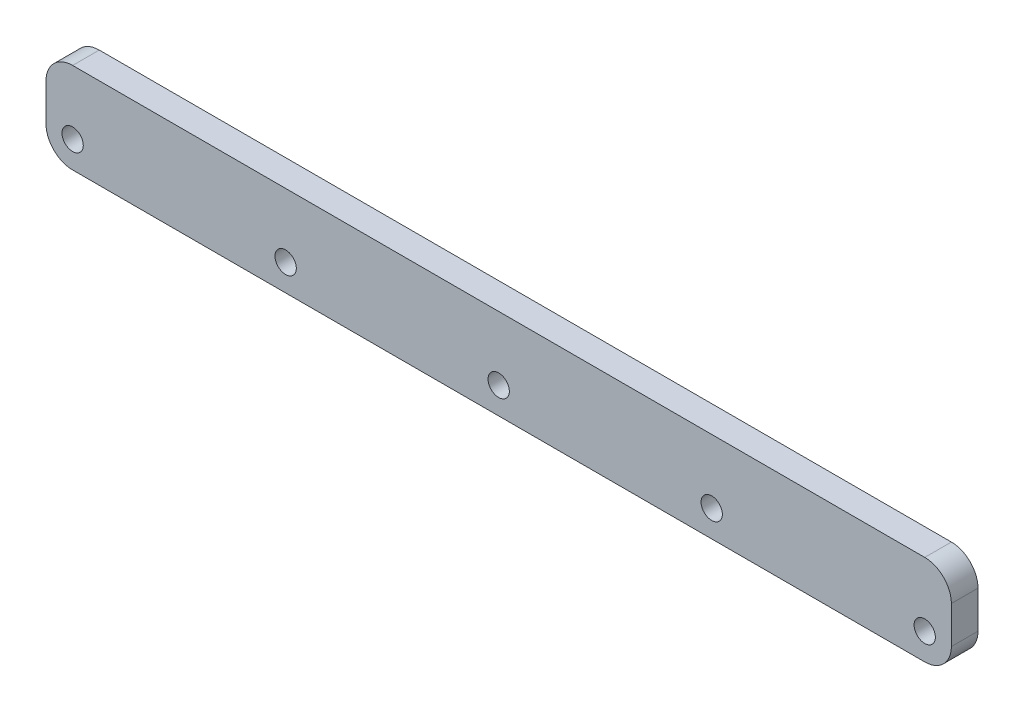
ISO-10303-21;
HEADER;
FILE_DESCRIPTION(('STEP AP214'),'2;1');
FILE_NAME('part.step','',(''),(''),'','','');
FILE_SCHEMA(('AUTOMOTIVE_DESIGN { 1 0 10303 214 1 1 1 1 }'));
ENDSEC;
DATA;
#1=APPLICATION_CONTEXT('core data for automotive mechanical design processes');
#2=APPLICATION_PROTOCOL_DEFINITION('international standard','automotive_design',2000,#1);
#3=PRODUCT_CONTEXT('',#1,'mechanical');
#4=PRODUCT('Part','Part','',(#3));
#5=PRODUCT_RELATED_PRODUCT_CATEGORY('part','',(#4));
#6=PRODUCT_DEFINITION_FORMATION('','',#4);
#7=PRODUCT_DEFINITION_CONTEXT('part definition',#1,'design');
#8=PRODUCT_DEFINITION('design','',#6,#7);
#9=PRODUCT_DEFINITION_SHAPE('','',#8);
#10=(LENGTH_UNIT() NAMED_UNIT(*) SI_UNIT(.MILLI.,.METRE.));
#11=(NAMED_UNIT(*) PLANE_ANGLE_UNIT() SI_UNIT($,.RADIAN.));
#12=(NAMED_UNIT(*) SI_UNIT($,.STERADIAN.) SOLID_ANGLE_UNIT());
#13=UNCERTAINTY_MEASURE_WITH_UNIT(LENGTH_MEASURE(1.E-05),#10,'distance_accuracy_value','');
#14=(GEOMETRIC_REPRESENTATION_CONTEXT(3) GLOBAL_UNCERTAINTY_ASSIGNED_CONTEXT((#13)) GLOBAL_UNIT_ASSIGNED_CONTEXT((#10,
#11,#12)) REPRESENTATION_CONTEXT('',''));
#15=CARTESIAN_POINT('',(0.,0.,0.));
#16=DIRECTION('',(0.,0.,1.));
#17=DIRECTION('',(1.,0.,0.));
#18=AXIS2_PLACEMENT_3D('',#15,#16,#17);
#19=CARTESIAN_POINT('',(0.,0.,5.));
#20=DIRECTION('',(0.,0.,-1.));
#21=DIRECTION('',(-1.,0.,0.));
#22=AXIS2_PLACEMENT_3D('',#19,#20,#21);
#23=PLANE('',#22);
#24=DIRECTION('',(1.,0.,0.));
#25=VECTOR('',#24,1.);
#26=CARTESIAN_POINT('',(0.,0.,5.));
#27=LINE('',#26,#25);
#28=CARTESIAN_POINT('',(5.,0.,5.));
#29=VERTEX_POINT('',#28);
#30=CARTESIAN_POINT('',(165.,0.,5.));
#31=VERTEX_POINT('',#30);
#32=EDGE_CURVE('E171',#29,#31,#27,.T.);
#33=ORIENTED_EDGE('',*,*,#32,.T.);
#34=CARTESIAN_POINT('',(165.,5.,5.));
#35=DIRECTION('',(0.,0.,-1.));
#36=DIRECTION('',(-1.,0.,0.));
#37=AXIS2_PLACEMENT_3D('',#34,#35,#36);
#38=CIRCLE('',#37,5.);
#39=CARTESIAN_POINT('',(170.,5.,5.));
#40=VERTEX_POINT('',#39);
#41=EDGE_CURVE('E148',#31,#40,#38,.F.);
#42=ORIENTED_EDGE('',*,*,#41,.T.);
#43=DIRECTION('',(0.,1.,0.));
#44=VECTOR('',#43,1.);
#45=CARTESIAN_POINT('',(170.,0.,5.));
#46=LINE('',#45,#44);
#47=CARTESIAN_POINT('',(170.,12.,5.));
#48=VERTEX_POINT('',#47);
#49=EDGE_CURVE('E118',#40,#48,#46,.T.);
#50=ORIENTED_EDGE('',*,*,#49,.T.);
#51=CARTESIAN_POINT('',(165.,12.,5.));
#52=DIRECTION('',(0.,0.,-1.));
#53=DIRECTION('',(-1.,0.,0.));
#54=AXIS2_PLACEMENT_3D('',#51,#52,#53);
#55=CIRCLE('',#54,5.);
#56=CARTESIAN_POINT('',(165.,17.,5.));
#57=VERTEX_POINT('',#56);
#58=EDGE_CURVE('E55',#48,#57,#55,.F.);
#59=ORIENTED_EDGE('',*,*,#58,.T.);
#60=DIRECTION('',(-1.,0.,0.));
#61=VECTOR('',#60,1.);
#62=CARTESIAN_POINT('',(0.,17.,5.));
#63=LINE('',#62,#61);
#64=CARTESIAN_POINT('',(5.,17.,5.));
#65=VERTEX_POINT('',#64);
#66=EDGE_CURVE('E134',#57,#65,#63,.T.);
#67=ORIENTED_EDGE('',*,*,#66,.T.);
#68=CARTESIAN_POINT('',(5.,12.,5.));
#69=DIRECTION('',(0.,0.,-1.));
#70=DIRECTION('',(-1.,0.,0.));
#71=AXIS2_PLACEMENT_3D('',#68,#69,#70);
#72=CIRCLE('',#71,5.);
#73=CARTESIAN_POINT('',(0.,12.,5.));
#74=VERTEX_POINT('',#73);
#75=EDGE_CURVE('E143',#65,#74,#72,.F.);
#76=ORIENTED_EDGE('',*,*,#75,.T.);
#77=DIRECTION('',(0.,-1.,0.));
#78=VECTOR('',#77,1.);
#79=CARTESIAN_POINT('',(0.,0.,5.));
#80=LINE('',#79,#78);
#81=CARTESIAN_POINT('',(0.,5.,5.));
#82=VERTEX_POINT('',#81);
#83=EDGE_CURVE('E128',#74,#82,#80,.T.);
#84=ORIENTED_EDGE('',*,*,#83,.T.);
#85=CARTESIAN_POINT('',(5.,5.,5.));
#86=DIRECTION('',(0.,0.,-1.));
#87=DIRECTION('',(-1.,0.,0.));
#88=AXIS2_PLACEMENT_3D('',#85,#86,#87);
#89=CIRCLE('',#88,5.);
#90=EDGE_CURVE('E145',#82,#29,#89,.F.);
#91=ORIENTED_EDGE('',*,*,#90,.T.);
#92=EDGE_LOOP('',(#33,#42,#50,#59,#67,#76,#84,#91));
#93=FACE_BOUND('',#92,.T.);
#94=CARTESIAN_POINT('',(5.,5.,5.));
#95=DIRECTION('',(0.,0.,1.));
#96=DIRECTION('',(1.,0.,0.));
#97=AXIS2_PLACEMENT_3D('',#94,#95,#96);
#98=CIRCLE('',#97,2.);
#99=CARTESIAN_POINT('',(7.,5.,5.));
#100=VERTEX_POINT('',#99);
#101=EDGE_CURVE('E164',#100,#100,#98,.T.);
#102=ORIENTED_EDGE('',*,*,#101,.F.);
#103=EDGE_LOOP('',(#102));
#104=FACE_BOUND('',#103,.T.);
#105=CARTESIAN_POINT('',(45.,5.,5.));
#106=DIRECTION('',(0.,0.,1.));
#107=DIRECTION('',(1.,0.,0.));
#108=AXIS2_PLACEMENT_3D('',#105,#106,#107);
#109=CIRCLE('',#108,2.);
#110=CARTESIAN_POINT('',(47.,5.,5.));
#111=VERTEX_POINT('',#110);
#112=EDGE_CURVE('E176',#111,#111,#109,.T.);
#113=ORIENTED_EDGE('',*,*,#112,.F.);
#114=EDGE_LOOP('',(#113));
#115=FACE_BOUND('',#114,.T.);
#116=CARTESIAN_POINT('',(85.,5.,5.));
#117=DIRECTION('',(0.,0.,1.));
#118=DIRECTION('',(1.,0.,0.));
#119=AXIS2_PLACEMENT_3D('',#116,#117,#118);
#120=CIRCLE('',#119,2.);
#121=CARTESIAN_POINT('',(87.,5.,5.));
#122=VERTEX_POINT('',#121);
#123=EDGE_CURVE('E181',#122,#122,#120,.T.);
#124=ORIENTED_EDGE('',*,*,#123,.F.);
#125=EDGE_LOOP('',(#124));
#126=FACE_BOUND('',#125,.T.);
#127=CARTESIAN_POINT('',(125.,5.,5.));
#128=DIRECTION('',(0.,0.,1.));
#129=DIRECTION('',(1.,0.,0.));
#130=AXIS2_PLACEMENT_3D('',#127,#128,#129);
#131=CIRCLE('',#130,2.);
#132=CARTESIAN_POINT('',(127.,5.,5.));
#133=VERTEX_POINT('',#132);
#134=EDGE_CURVE('E187',#133,#133,#131,.T.);
#135=ORIENTED_EDGE('',*,*,#134,.F.);
#136=EDGE_LOOP('',(#135));
#137=FACE_BOUND('',#136,.T.);
#138=CARTESIAN_POINT('',(165.,5.,5.));
#139=DIRECTION('',(0.,0.,1.));
#140=DIRECTION('',(1.,0.,0.));
#141=AXIS2_PLACEMENT_3D('',#138,#139,#140);
#142=CIRCLE('',#141,2.);
#143=CARTESIAN_POINT('',(167.,5.,5.));
#144=VERTEX_POINT('',#143);
#145=EDGE_CURVE('E193',#144,#144,#142,.T.);
#146=ORIENTED_EDGE('',*,*,#145,.F.);
#147=EDGE_LOOP('',(#146));
#148=FACE_BOUND('',#147,.T.);
#149=ADVANCED_FACE('F33',(#93,#104,#115,#126,#137,#148),#23,.F.);
#150=CARTESIAN_POINT('',(0.,0.,0.));
#151=DIRECTION('',(0.,0.,-1.));
#152=DIRECTION('',(-1.,0.,0.));
#153=AXIS2_PLACEMENT_3D('',#150,#151,#152);
#154=PLANE('',#153);
#155=CARTESIAN_POINT('',(125.,5.,0.));
#156=DIRECTION('',(0.,0.,1.));
#157=DIRECTION('',(1.,0.,0.));
#158=AXIS2_PLACEMENT_3D('',#155,#156,#157);
#159=CIRCLE('',#158,2.);
#160=CARTESIAN_POINT('',(127.,5.,0.));
#161=VERTEX_POINT('',#160);
#162=EDGE_CURVE('E190',#161,#161,#159,.T.);
#163=ORIENTED_EDGE('',*,*,#162,.T.);
#164=EDGE_LOOP('',(#163));
#165=FACE_BOUND('',#164,.T.);
#166=CARTESIAN_POINT('',(45.,5.,0.));
#167=DIRECTION('',(0.,0.,1.));
#168=DIRECTION('',(1.,0.,0.));
#169=AXIS2_PLACEMENT_3D('',#166,#167,#168);
#170=CIRCLE('',#169,2.);
#171=CARTESIAN_POINT('',(47.,5.,0.));
#172=VERTEX_POINT('',#171);
#173=EDGE_CURVE('E178',#172,#172,#170,.T.);
#174=ORIENTED_EDGE('',*,*,#173,.T.);
#175=EDGE_LOOP('',(#174));
#176=FACE_BOUND('',#175,.T.);
#177=DIRECTION('',(0.,1.,0.));
#178=VECTOR('',#177,1.);
#179=CARTESIAN_POINT('',(170.,0.,0.));
#180=LINE('',#179,#178);
#181=CARTESIAN_POINT('',(170.,5.,0.));
#182=VERTEX_POINT('',#181);
#183=CARTESIAN_POINT('',(170.,12.,0.));
#184=VERTEX_POINT('',#183);
#185=EDGE_CURVE('E116',#182,#184,#180,.T.);
#186=ORIENTED_EDGE('',*,*,#185,.F.);
#187=CARTESIAN_POINT('',(165.,5.,0.));
#188=DIRECTION('',(0.,0.,-1.));
#189=DIRECTION('',(-1.,0.,0.));
#190=AXIS2_PLACEMENT_3D('',#187,#188,#189);
#191=CIRCLE('',#190,5.);
#192=CARTESIAN_POINT('',(165.,0.,0.));
#193=VERTEX_POINT('',#192);
#194=EDGE_CURVE('E99',#182,#193,#191,.T.);
#195=ORIENTED_EDGE('',*,*,#194,.T.);
#196=DIRECTION('',(1.,0.,0.));
#197=VECTOR('',#196,1.);
#198=CARTESIAN_POINT('',(0.,0.,0.));
#199=LINE('',#198,#197);
#200=CARTESIAN_POINT('',(5.,0.,0.));
#201=VERTEX_POINT('',#200);
#202=EDGE_CURVE('E126',#201,#193,#199,.T.);
#203=ORIENTED_EDGE('',*,*,#202,.F.);
#204=CARTESIAN_POINT('',(5.,5.,0.));
#205=DIRECTION('',(0.,0.,-1.));
#206=DIRECTION('',(-1.,0.,0.));
#207=AXIS2_PLACEMENT_3D('',#204,#205,#206);
#208=CIRCLE('',#207,5.);
#209=CARTESIAN_POINT('',(0.,5.,0.));
#210=VERTEX_POINT('',#209);
#211=EDGE_CURVE('E137',#201,#210,#208,.T.);
#212=ORIENTED_EDGE('',*,*,#211,.T.);
#213=DIRECTION('',(0.,-1.,0.));
#214=VECTOR('',#213,1.);
#215=CARTESIAN_POINT('',(0.,0.,0.));
#216=LINE('',#215,#214);
#217=CARTESIAN_POINT('',(0.,12.,0.));
#218=VERTEX_POINT('',#217);
#219=EDGE_CURVE('E130',#218,#210,#216,.T.);
#220=ORIENTED_EDGE('',*,*,#219,.F.);
#221=CARTESIAN_POINT('',(5.,12.,0.));
#222=DIRECTION('',(0.,0.,-1.));
#223=DIRECTION('',(-1.,0.,0.));
#224=AXIS2_PLACEMENT_3D('',#221,#222,#223);
#225=CIRCLE('',#224,5.);
#226=CARTESIAN_POINT('',(5.,17.,0.));
#227=VERTEX_POINT('',#226);
#228=EDGE_CURVE('E119',#218,#227,#225,.T.);
#229=ORIENTED_EDGE('',*,*,#228,.T.);
#230=DIRECTION('',(-1.,0.,0.));
#231=VECTOR('',#230,1.);
#232=CARTESIAN_POINT('',(0.,17.,0.));
#233=LINE('',#232,#231);
#234=CARTESIAN_POINT('',(165.,17.,0.));
#235=VERTEX_POINT('',#234);
#236=EDGE_CURVE('E125',#235,#227,#233,.T.);
#237=ORIENTED_EDGE('',*,*,#236,.F.);
#238=CARTESIAN_POINT('',(165.,12.,0.));
#239=DIRECTION('',(0.,0.,-1.));
#240=DIRECTION('',(-1.,0.,0.));
#241=AXIS2_PLACEMENT_3D('',#238,#239,#240);
#242=CIRCLE('',#241,5.);
#243=EDGE_CURVE('E110',#235,#184,#242,.T.);
#244=ORIENTED_EDGE('',*,*,#243,.T.);
#245=EDGE_LOOP('',(#186,#195,#203,#212,#220,#229,#237,#244));
#246=FACE_BOUND('',#245,.T.);
#247=CARTESIAN_POINT('',(5.,5.,0.));
#248=DIRECTION('',(0.,0.,1.));
#249=DIRECTION('',(1.,0.,0.));
#250=AXIS2_PLACEMENT_3D('',#247,#248,#249);
#251=CIRCLE('',#250,2.);
#252=CARTESIAN_POINT('',(7.,5.,0.));
#253=VERTEX_POINT('',#252);
#254=EDGE_CURVE('E166',#253,#253,#251,.T.);
#255=ORIENTED_EDGE('',*,*,#254,.T.);
#256=EDGE_LOOP('',(#255));
#257=FACE_BOUND('',#256,.T.);
#258=CARTESIAN_POINT('',(85.,5.,0.));
#259=DIRECTION('',(0.,0.,1.));
#260=DIRECTION('',(1.,0.,0.));
#261=AXIS2_PLACEMENT_3D('',#258,#259,#260);
#262=CIRCLE('',#261,2.);
#263=CARTESIAN_POINT('',(87.,5.,0.));
#264=VERTEX_POINT('',#263);
#265=EDGE_CURVE('E184',#264,#264,#262,.T.);
#266=ORIENTED_EDGE('',*,*,#265,.T.);
#267=EDGE_LOOP('',(#266));
#268=FACE_BOUND('',#267,.T.);
#269=CARTESIAN_POINT('',(165.,5.,0.));
#270=DIRECTION('',(0.,0.,1.));
#271=DIRECTION('',(1.,0.,0.));
#272=AXIS2_PLACEMENT_3D('',#269,#270,#271);
#273=CIRCLE('',#272,2.);
#274=CARTESIAN_POINT('',(167.,5.,0.));
#275=VERTEX_POINT('',#274);
#276=EDGE_CURVE('E196',#275,#275,#273,.T.);
#277=ORIENTED_EDGE('',*,*,#276,.T.);
#278=EDGE_LOOP('',(#277));
#279=FACE_BOUND('',#278,.T.);
#280=ADVANCED_FACE('F122',(#165,#176,#246,#257,#268,#279),#154,.T.);
#281=CARTESIAN_POINT('',(0.,0.,5.));
#282=DIRECTION('',(1.,0.,0.));
#283=DIRECTION('',(0.,0.,-1.));
#284=AXIS2_PLACEMENT_3D('',#281,#282,#283);
#285=PLANE('',#284);
#286=ORIENTED_EDGE('',*,*,#219,.T.);
#287=DIRECTION('',(0.,0.,-1.));
#288=VECTOR('',#287,1.);
#289=CARTESIAN_POINT('',(0.,5.,5.));
#290=LINE('',#289,#288);
#291=EDGE_CURVE('E11',#210,#82,#290,.F.);
#292=ORIENTED_EDGE('',*,*,#291,.T.);
#293=ORIENTED_EDGE('',*,*,#83,.F.);
#294=DIRECTION('',(0.,0.,-1.));
#295=VECTOR('',#294,1.);
#296=CARTESIAN_POINT('',(0.,12.,5.));
#297=LINE('',#296,#295);
#298=EDGE_CURVE('E41',#74,#218,#297,.T.);
#299=ORIENTED_EDGE('',*,*,#298,.T.);
#300=EDGE_LOOP('',(#286,#292,#293,#299));
#301=FACE_BOUND('',#300,.T.);
#302=ADVANCED_FACE('F159',(#301),#285,.F.);
#303=CARTESIAN_POINT('',(0.,0.,5.));
#304=DIRECTION('',(0.,1.,0.));
#305=DIRECTION('',(0.,0.,1.));
#306=AXIS2_PLACEMENT_3D('',#303,#304,#305);
#307=PLANE('',#306);
#308=ORIENTED_EDGE('',*,*,#202,.T.);
#309=DIRECTION('',(0.,0.,-1.));
#310=VECTOR('',#309,1.);
#311=CARTESIAN_POINT('',(165.,0.,5.));
#312=LINE('',#311,#310);
#313=EDGE_CURVE('E104',#193,#31,#312,.F.);
#314=ORIENTED_EDGE('',*,*,#313,.T.);
#315=ORIENTED_EDGE('',*,*,#32,.F.);
#316=DIRECTION('',(0.,0.,-1.));
#317=VECTOR('',#316,1.);
#318=CARTESIAN_POINT('',(5.,0.,5.));
#319=LINE('',#318,#317);
#320=EDGE_CURVE('E109',#29,#201,#319,.T.);
#321=ORIENTED_EDGE('',*,*,#320,.T.);
#322=EDGE_LOOP('',(#308,#314,#315,#321));
#323=FACE_BOUND('',#322,.T.);
#324=ADVANCED_FACE('F222',(#323),#307,.F.);
#325=CARTESIAN_POINT('',(170.,0.,5.));
#326=DIRECTION('',(-1.,0.,0.));
#327=DIRECTION('',(0.,0.,1.));
#328=AXIS2_PLACEMENT_3D('',#325,#326,#327);
#329=PLANE('',#328);
#330=ORIENTED_EDGE('',*,*,#49,.F.);
#331=DIRECTION('',(0.,0.,-1.));
#332=VECTOR('',#331,1.);
#333=CARTESIAN_POINT('',(170.,5.,5.));
#334=LINE('',#333,#332);
#335=EDGE_CURVE('E103',#40,#182,#334,.T.);
#336=ORIENTED_EDGE('',*,*,#335,.T.);
#337=ORIENTED_EDGE('',*,*,#185,.T.);
#338=DIRECTION('',(0.,0.,-1.));
#339=VECTOR('',#338,1.);
#340=CARTESIAN_POINT('',(170.,12.,5.));
#341=LINE('',#340,#339);
#342=EDGE_CURVE('E120',#184,#48,#341,.F.);
#343=ORIENTED_EDGE('',*,*,#342,.T.);
#344=EDGE_LOOP('',(#330,#336,#337,#343));
#345=FACE_BOUND('',#344,.T.);
#346=ADVANCED_FACE('F115',(#345),#329,.F.);
#347=CARTESIAN_POINT('',(0.,17.,5.));
#348=DIRECTION('',(0.,-1.,0.));
#349=DIRECTION('',(0.,0.,-1.));
#350=AXIS2_PLACEMENT_3D('',#347,#348,#349);
#351=PLANE('',#350);
#352=ORIENTED_EDGE('',*,*,#66,.F.);
#353=DIRECTION('',(0.,0.,-1.));
#354=VECTOR('',#353,1.);
#355=CARTESIAN_POINT('',(165.,17.,5.));
#356=LINE('',#355,#354);
#357=EDGE_CURVE('E151',#57,#235,#356,.T.);
#358=ORIENTED_EDGE('',*,*,#357,.T.);
#359=ORIENTED_EDGE('',*,*,#236,.T.);
#360=DIRECTION('',(0.,0.,-1.));
#361=VECTOR('',#360,1.);
#362=CARTESIAN_POINT('',(5.,17.,5.));
#363=LINE('',#362,#361);
#364=EDGE_CURVE('E48',#227,#65,#363,.F.);
#365=ORIENTED_EDGE('',*,*,#364,.T.);
#366=EDGE_LOOP('',(#352,#358,#359,#365));
#367=FACE_BOUND('',#366,.T.);
#368=ADVANCED_FACE('F217',(#367),#351,.F.);
#369=CARTESIAN_POINT('',(5.,5.,5.));
#370=DIRECTION('',(0.,0.,-1.));
#371=DIRECTION('',(-1.,0.,0.));
#372=AXIS2_PLACEMENT_3D('',#369,#370,#371);
#373=CYLINDRICAL_SURFACE('',#372,2.);
#374=ORIENTED_EDGE('',*,*,#101,.T.);
#375=EDGE_LOOP('',(#374));
#376=FACE_BOUND('',#375,.T.);
#377=ORIENTED_EDGE('',*,*,#254,.F.);
#378=EDGE_LOOP('',(#377));
#379=FACE_BOUND('',#378,.T.);
#380=ADVANCED_FACE('F214',(#376,#379),#373,.F.);
#381=CARTESIAN_POINT('',(45.,5.,5.));
#382=DIRECTION('',(0.,0.,-1.));
#383=DIRECTION('',(-1.,0.,0.));
#384=AXIS2_PLACEMENT_3D('',#381,#382,#383);
#385=CYLINDRICAL_SURFACE('',#384,2.);
#386=ORIENTED_EDGE('',*,*,#112,.T.);
#387=EDGE_LOOP('',(#386));
#388=FACE_BOUND('',#387,.T.);
#389=ORIENTED_EDGE('',*,*,#173,.F.);
#390=EDGE_LOOP('',(#389));
#391=FACE_BOUND('',#390,.T.);
#392=ADVANCED_FACE('F325',(#388,#391),#385,.F.);
#393=CARTESIAN_POINT('',(85.,5.,5.));
#394=DIRECTION('',(0.,0.,-1.));
#395=DIRECTION('',(-1.,0.,0.));
#396=AXIS2_PLACEMENT_3D('',#393,#394,#395);
#397=CYLINDRICAL_SURFACE('',#396,2.);
#398=ORIENTED_EDGE('',*,*,#123,.T.);
#399=EDGE_LOOP('',(#398));
#400=FACE_BOUND('',#399,.T.);
#401=ORIENTED_EDGE('',*,*,#265,.F.);
#402=EDGE_LOOP('',(#401));
#403=FACE_BOUND('',#402,.T.);
#404=ADVANCED_FACE('F315',(#400,#403),#397,.F.);
#405=CARTESIAN_POINT('',(125.,5.,5.));
#406=DIRECTION('',(0.,0.,-1.));
#407=DIRECTION('',(-1.,0.,0.));
#408=AXIS2_PLACEMENT_3D('',#405,#406,#407);
#409=CYLINDRICAL_SURFACE('',#408,2.);
#410=ORIENTED_EDGE('',*,*,#134,.T.);
#411=EDGE_LOOP('',(#410));
#412=FACE_BOUND('',#411,.T.);
#413=ORIENTED_EDGE('',*,*,#162,.F.);
#414=EDGE_LOOP('',(#413));
#415=FACE_BOUND('',#414,.T.);
#416=ADVANCED_FACE('F306',(#412,#415),#409,.F.);
#417=CARTESIAN_POINT('',(165.,5.,5.));
#418=DIRECTION('',(0.,0.,-1.));
#419=DIRECTION('',(-1.,0.,0.));
#420=AXIS2_PLACEMENT_3D('',#417,#418,#419);
#421=CYLINDRICAL_SURFACE('',#420,2.);
#422=ORIENTED_EDGE('',*,*,#145,.T.);
#423=EDGE_LOOP('',(#422));
#424=FACE_BOUND('',#423,.T.);
#425=ORIENTED_EDGE('',*,*,#276,.F.);
#426=EDGE_LOOP('',(#425));
#427=FACE_BOUND('',#426,.T.);
#428=ADVANCED_FACE('F202',(#424,#427),#421,.F.);
#429=CARTESIAN_POINT('',(165.,5.,5.));
#430=DIRECTION('',(0.,0.,-1.));
#431=DIRECTION('',(-1.,0.,0.));
#432=AXIS2_PLACEMENT_3D('',#429,#430,#431);
#433=CYLINDRICAL_SURFACE('',#432,5.);
#434=ORIENTED_EDGE('',*,*,#41,.F.);
#435=ORIENTED_EDGE('',*,*,#313,.F.);
#436=ORIENTED_EDGE('',*,*,#194,.F.);
#437=ORIENTED_EDGE('',*,*,#335,.F.);
#438=EDGE_LOOP('',(#434,#435,#436,#437));
#439=FACE_BOUND('',#438,.T.);
#440=ADVANCED_FACE('F102',(#439),#433,.T.);
#441=CARTESIAN_POINT('',(165.,12.,5.));
#442=DIRECTION('',(0.,0.,-1.));
#443=DIRECTION('',(-1.,0.,0.));
#444=AXIS2_PLACEMENT_3D('',#441,#442,#443);
#445=CYLINDRICAL_SURFACE('',#444,5.);
#446=ORIENTED_EDGE('',*,*,#58,.F.);
#447=ORIENTED_EDGE('',*,*,#342,.F.);
#448=ORIENTED_EDGE('',*,*,#243,.F.);
#449=ORIENTED_EDGE('',*,*,#357,.F.);
#450=EDGE_LOOP('',(#446,#447,#448,#449));
#451=FACE_BOUND('',#450,.T.);
#452=ADVANCED_FACE('F230',(#451),#445,.T.);
#453=CARTESIAN_POINT('',(5.,5.,5.));
#454=DIRECTION('',(0.,0.,-1.));
#455=DIRECTION('',(-1.,0.,0.));
#456=AXIS2_PLACEMENT_3D('',#453,#454,#455);
#457=CYLINDRICAL_SURFACE('',#456,5.);
#458=ORIENTED_EDGE('',*,*,#90,.F.);
#459=ORIENTED_EDGE('',*,*,#291,.F.);
#460=ORIENTED_EDGE('',*,*,#211,.F.);
#461=ORIENTED_EDGE('',*,*,#320,.F.);
#462=EDGE_LOOP('',(#458,#459,#460,#461));
#463=FACE_BOUND('',#462,.T.);
#464=ADVANCED_FACE('F232',(#463),#457,.T.);
#465=CARTESIAN_POINT('',(5.,12.,5.));
#466=DIRECTION('',(0.,0.,-1.));
#467=DIRECTION('',(-1.,0.,0.));
#468=AXIS2_PLACEMENT_3D('',#465,#466,#467);
#469=CYLINDRICAL_SURFACE('',#468,5.);
#470=ORIENTED_EDGE('',*,*,#75,.F.);
#471=ORIENTED_EDGE('',*,*,#364,.F.);
#472=ORIENTED_EDGE('',*,*,#228,.F.);
#473=ORIENTED_EDGE('',*,*,#298,.F.);
#474=EDGE_LOOP('',(#470,#471,#472,#473));
#475=FACE_BOUND('',#474,.T.);
#476=ADVANCED_FACE('F35',(#475),#469,.T.);
#477=CLOSED_SHELL('',(#149,#280,#302,#324,#346,#368,#380,#392,#404,#416,#428,#440,#452,#464,#476));
#478=MANIFOLD_SOLID_BREP('B2',#477);
#479=ADVANCED_BREP_SHAPE_REPRESENTATION('',(#18,#478),#14);
#480=SHAPE_DEFINITION_REPRESENTATION(#9,#479);
ENDSEC;
END-ISO-10303-21;
